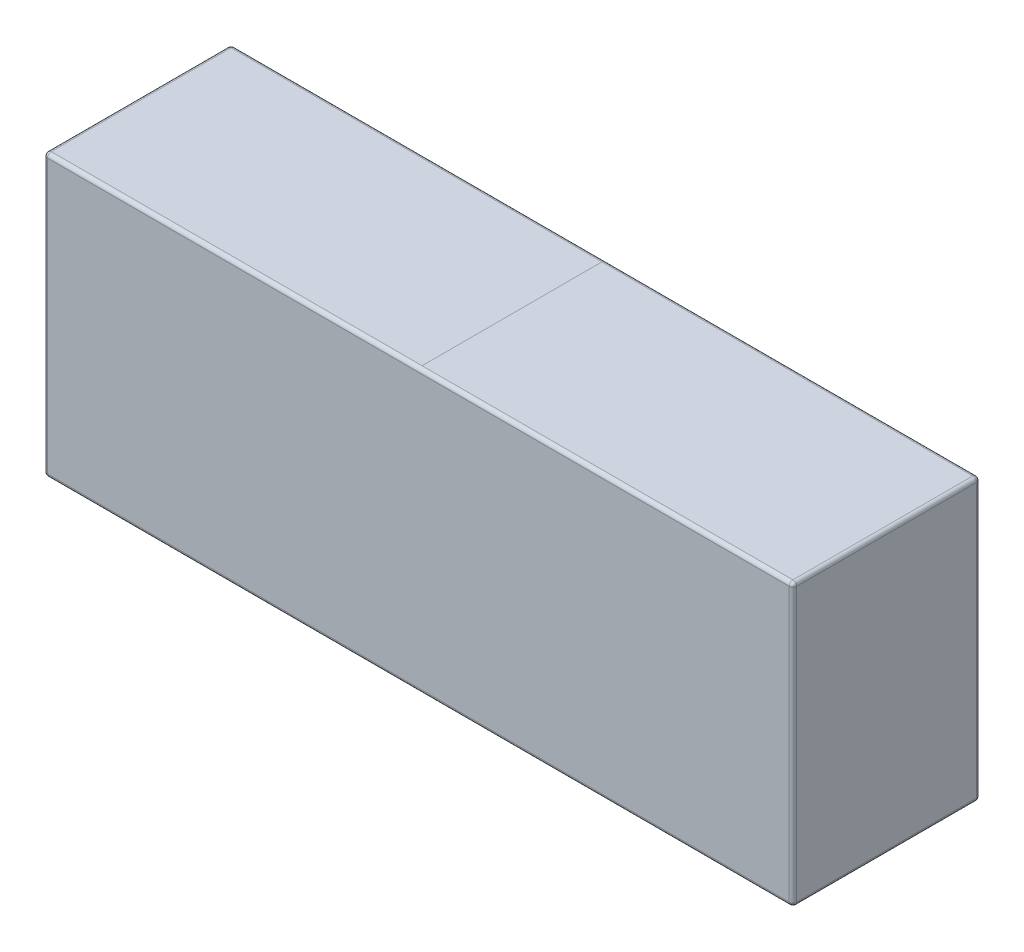
ISO-10303-21;
HEADER;
FILE_DESCRIPTION(('STEP AP214'),'2;1');
FILE_NAME('part.step','',(''),(''),'','','');
FILE_SCHEMA(('AUTOMOTIVE_DESIGN { 1 0 10303 214 1 1 1 1 }'));
ENDSEC;
DATA;
#1=APPLICATION_CONTEXT('core data for automotive mechanical design processes');
#2=APPLICATION_PROTOCOL_DEFINITION('international standard','automotive_design',2000,#1);
#3=PRODUCT_CONTEXT('',#1,'mechanical');
#4=PRODUCT('Part','Part','',(#3));
#5=PRODUCT_RELATED_PRODUCT_CATEGORY('part','',(#4));
#6=PRODUCT_DEFINITION_FORMATION('','',#4);
#7=PRODUCT_DEFINITION_CONTEXT('part definition',#1,'design');
#8=PRODUCT_DEFINITION('design','',#6,#7);
#9=PRODUCT_DEFINITION_SHAPE('','',#8);
#10=(LENGTH_UNIT() NAMED_UNIT(*) SI_UNIT(.MILLI.,.METRE.));
#11=(NAMED_UNIT(*) PLANE_ANGLE_UNIT() SI_UNIT($,.RADIAN.));
#12=(NAMED_UNIT(*) SI_UNIT($,.STERADIAN.) SOLID_ANGLE_UNIT());
#13=UNCERTAINTY_MEASURE_WITH_UNIT(LENGTH_MEASURE(1.E-05),#10,'distance_accuracy_value','');
#14=(GEOMETRIC_REPRESENTATION_CONTEXT(3) GLOBAL_UNCERTAINTY_ASSIGNED_CONTEXT((#13)) GLOBAL_UNIT_ASSIGNED_CONTEXT((#10,
#11,#12)) REPRESENTATION_CONTEXT('',''));
#15=CARTESIAN_POINT('',(0.,0.,0.));
#16=DIRECTION('',(0.,0.,1.));
#17=DIRECTION('',(1.,0.,0.));
#18=AXIS2_PLACEMENT_3D('',#15,#16,#17);
#19=CARTESIAN_POINT('',(-20.,7.5,10.));
#20=DIRECTION('',(0.,-1.,0.));
#21=DIRECTION('',(0.,0.,-1.));
#22=AXIS2_PLACEMENT_3D('',#19,#20,#21);
#23=PLANE('',#22);
#24=DIRECTION('',(0.,0.,1.));
#25=VECTOR('',#24,1.);
#26=CARTESIAN_POINT('',(0.,7.5,10.));
#27=LINE('',#26,#25);
#28=CARTESIAN_POINT('',(0.,7.5,0.200000000000001));
#29=VERTEX_POINT('',#28);
#30=CARTESIAN_POINT('',(0.,7.5,9.8));
#31=VERTEX_POINT('',#30);
#32=EDGE_CURVE('E11',#29,#31,#27,.T.);
#33=ORIENTED_EDGE('',*,*,#32,.F.);
#34=DIRECTION('',(-1.,0.,0.));
#35=VECTOR('',#34,1.);
#36=CARTESIAN_POINT('',(-20.,7.5,0.200000000000001));
#37=LINE('',#36,#35);
#38=CARTESIAN_POINT('',(-19.8,7.5,0.200000000000001));
#39=VERTEX_POINT('',#38);
#40=EDGE_CURVE('E218',#29,#39,#37,.T.);
#41=ORIENTED_EDGE('',*,*,#40,.T.);
#42=DIRECTION('',(0.,0.,-1.));
#43=VECTOR('',#42,1.);
#44=CARTESIAN_POINT('',(-19.8,7.5,10.));
#45=LINE('',#44,#43);
#46=CARTESIAN_POINT('',(-19.8,7.5,9.8));
#47=VERTEX_POINT('',#46);
#48=EDGE_CURVE('E221',#39,#47,#45,.F.);
#49=ORIENTED_EDGE('',*,*,#48,.T.);
#50=DIRECTION('',(-1.,0.,0.));
#51=VECTOR('',#50,1.);
#52=CARTESIAN_POINT('',(20.,7.5,9.8));
#53=LINE('',#52,#51);
#54=EDGE_CURVE('E224',#47,#31,#53,.F.);
#55=ORIENTED_EDGE('',*,*,#54,.T.);
#56=EDGE_LOOP('',(#33,#41,#49,#55));
#57=FACE_BOUND('',#56,.T.);
#58=ADVANCED_FACE('F46',(#57),#23,.F.);
#59=CARTESIAN_POINT('',(20.,7.5,10.));
#60=DIRECTION('',(-1.,0.,0.));
#61=DIRECTION('',(0.,0.,1.));
#62=AXIS2_PLACEMENT_3D('',#59,#60,#61);
#63=PLANE('',#62);
#64=DIRECTION('',(0.,1.,0.));
#65=VECTOR('',#64,1.);
#66=CARTESIAN_POINT('',(20.,-7.5,9.8));
#67=LINE('',#66,#65);
#68=CARTESIAN_POINT('',(20.,7.3,9.8));
#69=VERTEX_POINT('',#68);
#70=CARTESIAN_POINT('',(20.,-7.3,9.8));
#71=VERTEX_POINT('',#70);
#72=EDGE_CURVE('E204',#69,#71,#67,.F.);
#73=ORIENTED_EDGE('',*,*,#72,.T.);
#74=DIRECTION('',(0.,0.,-1.));
#75=VECTOR('',#74,1.);
#76=CARTESIAN_POINT('',(20.,-7.3,10.));
#77=LINE('',#76,#75);
#78=CARTESIAN_POINT('',(20.,-7.3,0.200000000000001));
#79=VERTEX_POINT('',#78);
#80=EDGE_CURVE('E157',#71,#79,#77,.T.);
#81=ORIENTED_EDGE('',*,*,#80,.T.);
#82=DIRECTION('',(0.,1.,0.));
#83=VECTOR('',#82,1.);
#84=CARTESIAN_POINT('',(20.,7.5,0.200000000000001));
#85=LINE('',#84,#83);
#86=CARTESIAN_POINT('',(20.,7.3,0.200000000000001));
#87=VERTEX_POINT('',#86);
#88=EDGE_CURVE('E206',#79,#87,#85,.T.);
#89=ORIENTED_EDGE('',*,*,#88,.T.);
#90=DIRECTION('',(0.,0.,-1.));
#91=VECTOR('',#90,1.);
#92=CARTESIAN_POINT('',(20.,7.3,10.));
#93=LINE('',#92,#91);
#94=EDGE_CURVE('E202',#87,#69,#93,.F.);
#95=ORIENTED_EDGE('',*,*,#94,.T.);
#96=EDGE_LOOP('',(#73,#81,#89,#95));
#97=FACE_BOUND('',#96,.T.);
#98=ADVANCED_FACE('F318',(#97),#63,.F.);
#99=CARTESIAN_POINT('',(19.8,7.5,0.200000000000001));
#100=VERTEX_POINT('',#99);
#101=EDGE_CURVE('E219',#100,#29,#37,.T.);
#102=ORIENTED_EDGE('',*,*,#101,.T.);
#103=ORIENTED_EDGE('',*,*,#32,.T.);
#104=CARTESIAN_POINT('',(19.8,7.5,9.8));
#105=VERTEX_POINT('',#104);
#106=EDGE_CURVE('E223',#31,#105,#53,.F.);
#107=ORIENTED_EDGE('',*,*,#106,.T.);
#108=DIRECTION('',(0.,0.,-1.));
#109=VECTOR('',#108,1.);
#110=CARTESIAN_POINT('',(19.8,7.5,10.));
#111=LINE('',#110,#109);
#112=EDGE_CURVE('E55',#105,#100,#111,.T.);
#113=ORIENTED_EDGE('',*,*,#112,.T.);
#114=EDGE_LOOP('',(#102,#103,#107,#113));
#115=FACE_BOUND('',#114,.T.);
#116=ADVANCED_FACE('F299',(#115),#23,.F.);
#117=CARTESIAN_POINT('',(-20.,7.5,10.));
#118=DIRECTION('',(1.,0.,0.));
#119=DIRECTION('',(0.,1.,0.));
#120=AXIS2_PLACEMENT_3D('',#117,#118,#119);
#121=PLANE('',#120);
#122=DIRECTION('',(0.,-1.,0.));
#123=VECTOR('',#122,1.);
#124=CARTESIAN_POINT('',(-20.,7.5,0.200000000000001));
#125=LINE('',#124,#123);
#126=CARTESIAN_POINT('',(-20.,7.3,0.200000000000001));
#127=VERTEX_POINT('',#126);
#128=CARTESIAN_POINT('',(-20.,-7.3,0.200000000000001));
#129=VERTEX_POINT('',#128);
#130=EDGE_CURVE('E188',#127,#129,#125,.T.);
#131=ORIENTED_EDGE('',*,*,#130,.T.);
#132=DIRECTION('',(0.,0.,-1.));
#133=VECTOR('',#132,1.);
#134=CARTESIAN_POINT('',(-20.,-7.3,10.));
#135=LINE('',#134,#133);
#136=CARTESIAN_POINT('',(-20.,-7.3,9.8));
#137=VERTEX_POINT('',#136);
#138=EDGE_CURVE('E190',#129,#137,#135,.F.);
#139=ORIENTED_EDGE('',*,*,#138,.T.);
#140=DIRECTION('',(0.,-1.,0.));
#141=VECTOR('',#140,1.);
#142=CARTESIAN_POINT('',(-20.,7.5,9.8));
#143=LINE('',#142,#141);
#144=CARTESIAN_POINT('',(-20.,7.3,9.8));
#145=VERTEX_POINT('',#144);
#146=EDGE_CURVE('E186',#137,#145,#143,.F.);
#147=ORIENTED_EDGE('',*,*,#146,.T.);
#148=DIRECTION('',(0.,0.,-1.));
#149=VECTOR('',#148,1.);
#150=CARTESIAN_POINT('',(-20.,7.3,10.));
#151=LINE('',#150,#149);
#152=EDGE_CURVE('E184',#145,#127,#151,.T.);
#153=ORIENTED_EDGE('',*,*,#152,.T.);
#154=EDGE_LOOP('',(#131,#139,#147,#153));
#155=FACE_BOUND('',#154,.T.);
#156=ADVANCED_FACE('F325',(#155),#121,.F.);
#157=CARTESIAN_POINT('',(-20.,-7.5,10.));
#158=DIRECTION('',(0.,1.,0.));
#159=DIRECTION('',(0.,0.,1.));
#160=AXIS2_PLACEMENT_3D('',#157,#158,#159);
#161=PLANE('',#160);
#162=DIRECTION('',(1.,0.,0.));
#163=VECTOR('',#162,1.);
#164=CARTESIAN_POINT('',(-20.,-7.5,9.8));
#165=LINE('',#164,#163);
#166=CARTESIAN_POINT('',(19.8,-7.5,9.8));
#167=VERTEX_POINT('',#166);
#168=CARTESIAN_POINT('',(-19.8,-7.5,9.8));
#169=VERTEX_POINT('',#168);
#170=EDGE_CURVE('E143',#167,#169,#165,.F.);
#171=ORIENTED_EDGE('',*,*,#170,.T.);
#172=DIRECTION('',(0.,0.,-1.));
#173=VECTOR('',#172,1.);
#174=CARTESIAN_POINT('',(-19.8,-7.5,10.));
#175=LINE('',#174,#173);
#176=CARTESIAN_POINT('',(-19.8,-7.5,0.200000000000001));
#177=VERTEX_POINT('',#176);
#178=EDGE_CURVE('E182',#169,#177,#175,.T.);
#179=ORIENTED_EDGE('',*,*,#178,.T.);
#180=DIRECTION('',(1.,0.,0.));
#181=VECTOR('',#180,1.);
#182=CARTESIAN_POINT('',(-20.,-7.5,0.200000000000001));
#183=LINE('',#182,#181);
#184=CARTESIAN_POINT('',(19.8,-7.5,0.200000000000001));
#185=VERTEX_POINT('',#184);
#186=EDGE_CURVE('E146',#177,#185,#183,.T.);
#187=ORIENTED_EDGE('',*,*,#186,.T.);
#188=DIRECTION('',(0.,0.,-1.));
#189=VECTOR('',#188,1.);
#190=CARTESIAN_POINT('',(19.8,-7.5,10.));
#191=LINE('',#190,#189);
#192=EDGE_CURVE('E138',#185,#167,#191,.F.);
#193=ORIENTED_EDGE('',*,*,#192,.T.);
#194=EDGE_LOOP('',(#171,#179,#187,#193));
#195=FACE_BOUND('',#194,.T.);
#196=ADVANCED_FACE('F140',(#195),#161,.F.);
#197=CARTESIAN_POINT('',(0.,0.,10.));
#198=DIRECTION('',(0.,0.,1.));
#199=DIRECTION('',(1.,0.,0.));
#200=AXIS2_PLACEMENT_3D('',#197,#198,#199);
#201=PLANE('',#200);
#202=DIRECTION('',(0.,-1.,0.));
#203=VECTOR('',#202,1.);
#204=CARTESIAN_POINT('',(-19.8,-7.5,10.));
#205=LINE('',#204,#203);
#206=CARTESIAN_POINT('',(-19.8,7.3,10.));
#207=VERTEX_POINT('',#206);
#208=CARTESIAN_POINT('',(-19.8,-7.3,10.));
#209=VERTEX_POINT('',#208);
#210=EDGE_CURVE('E213',#207,#209,#205,.T.);
#211=ORIENTED_EDGE('',*,*,#210,.T.);
#212=DIRECTION('',(1.,0.,0.));
#213=VECTOR('',#212,1.);
#214=CARTESIAN_POINT('',(20.,-7.3,10.));
#215=LINE('',#214,#213);
#216=CARTESIAN_POINT('',(19.8,-7.3,10.));
#217=VERTEX_POINT('',#216);
#218=EDGE_CURVE('E215',#209,#217,#215,.T.);
#219=ORIENTED_EDGE('',*,*,#218,.T.);
#220=DIRECTION('',(0.,1.,0.));
#221=VECTOR('',#220,1.);
#222=CARTESIAN_POINT('',(19.8,7.5,10.));
#223=LINE('',#222,#221);
#224=CARTESIAN_POINT('',(19.8,7.3,10.));
#225=VERTEX_POINT('',#224);
#226=EDGE_CURVE('E211',#217,#225,#223,.T.);
#227=ORIENTED_EDGE('',*,*,#226,.T.);
#228=DIRECTION('',(-1.,0.,0.));
#229=VECTOR('',#228,1.);
#230=CARTESIAN_POINT('',(-20.,7.3,10.));
#231=LINE('',#230,#229);
#232=EDGE_CURVE('E209',#225,#207,#231,.T.);
#233=ORIENTED_EDGE('',*,*,#232,.T.);
#234=EDGE_LOOP('',(#211,#219,#227,#233));
#235=FACE_BOUND('',#234,.T.);
#236=ADVANCED_FACE('F313',(#235),#201,.T.);
#237=CARTESIAN_POINT('',(0.,0.,0.));
#238=DIRECTION('',(0.,0.,1.));
#239=DIRECTION('',(1.,0.,0.));
#240=AXIS2_PLACEMENT_3D('',#237,#238,#239);
#241=PLANE('',#240);
#242=DIRECTION('',(1.,0.,0.));
#243=VECTOR('',#242,1.);
#244=CARTESIAN_POINT('',(0.,-7.3,0.));
#245=LINE('',#244,#243);
#246=CARTESIAN_POINT('',(19.8,-7.3,0.));
#247=VERTEX_POINT('',#246);
#248=CARTESIAN_POINT('',(-19.8,-7.3,0.));
#249=VERTEX_POINT('',#248);
#250=EDGE_CURVE('E197',#247,#249,#245,.F.);
#251=ORIENTED_EDGE('',*,*,#250,.T.);
#252=DIRECTION('',(0.,-1.,0.));
#253=VECTOR('',#252,1.);
#254=CARTESIAN_POINT('',(-19.8,0.,0.));
#255=LINE('',#254,#253);
#256=CARTESIAN_POINT('',(-19.8,7.3,0.));
#257=VERTEX_POINT('',#256);
#258=EDGE_CURVE('E199',#249,#257,#255,.F.);
#259=ORIENTED_EDGE('',*,*,#258,.T.);
#260=DIRECTION('',(-1.,0.,0.));
#261=VECTOR('',#260,1.);
#262=CARTESIAN_POINT('',(0.,7.3,0.));
#263=LINE('',#262,#261);
#264=CARTESIAN_POINT('',(19.8,7.3,0.));
#265=VERTEX_POINT('',#264);
#266=EDGE_CURVE('E193',#257,#265,#263,.F.);
#267=ORIENTED_EDGE('',*,*,#266,.T.);
#268=DIRECTION('',(0.,1.,0.));
#269=VECTOR('',#268,1.);
#270=CARTESIAN_POINT('',(19.8,0.,0.));
#271=LINE('',#270,#269);
#272=EDGE_CURVE('E195',#265,#247,#271,.F.);
#273=ORIENTED_EDGE('',*,*,#272,.T.);
#274=EDGE_LOOP('',(#251,#259,#267,#273));
#275=FACE_BOUND('',#274,.T.);
#276=ADVANCED_FACE('F292',(#275),#241,.F.);
#277=CARTESIAN_POINT('',(19.8,7.3,10.));
#278=DIRECTION('',(0.,0.,-1.));
#279=DIRECTION('',(-1.,0.,0.));
#280=AXIS2_PLACEMENT_3D('',#277,#278,#279);
#281=CYLINDRICAL_SURFACE('',#280,0.2);
#282=CARTESIAN_POINT('',(19.8,7.3,9.8));
#283=DIRECTION('',(0.,0.,1.));
#284=DIRECTION('',(1.,0.,0.));
#285=AXIS2_PLACEMENT_3D('',#282,#283,#284);
#286=CIRCLE('',#285,0.2);
#287=EDGE_CURVE('E176',#69,#105,#286,.T.);
#288=ORIENTED_EDGE('',*,*,#287,.F.);
#289=ORIENTED_EDGE('',*,*,#94,.F.);
#290=CARTESIAN_POINT('',(19.8,7.3,0.200000000000001));
#291=DIRECTION('',(0.,0.,-1.));
#292=DIRECTION('',(-1.,0.,0.));
#293=AXIS2_PLACEMENT_3D('',#290,#291,#292);
#294=CIRCLE('',#293,0.2);
#295=EDGE_CURVE('E179',#100,#87,#294,.T.);
#296=ORIENTED_EDGE('',*,*,#295,.F.);
#297=ORIENTED_EDGE('',*,*,#112,.F.);
#298=EDGE_LOOP('',(#288,#289,#296,#297));
#299=FACE_BOUND('',#298,.T.);
#300=ADVANCED_FACE('F48',(#299),#281,.T.);
#301=CARTESIAN_POINT('',(19.8,7.3,9.8));
#302=DIRECTION('',(0.,1.,0.));
#303=DIRECTION('',(0.,0.,1.));
#304=AXIS2_PLACEMENT_3D('',#301,#302,#303);
#305=SPHERICAL_SURFACE('',#304,0.2);
#306=CARTESIAN_POINT('',(19.8,7.3,9.8));
#307=DIRECTION('',(0.,1.,0.));
#308=DIRECTION('',(0.,0.,1.));
#309=AXIS2_PLACEMENT_3D('',#306,#307,#308);
#310=CIRCLE('',#309,0.2);
#311=EDGE_CURVE('E270',#69,#225,#310,.F.);
#312=ORIENTED_EDGE('',*,*,#311,.F.);
#313=ORIENTED_EDGE('',*,*,#287,.T.);
#314=CARTESIAN_POINT('',(19.8,7.3,9.8));
#315=DIRECTION('',(1.,0.,0.));
#316=DIRECTION('',(0.,0.,-1.));
#317=AXIS2_PLACEMENT_3D('',#314,#315,#316);
#318=CIRCLE('',#317,0.2);
#319=EDGE_CURVE('E273',#225,#105,#318,.F.);
#320=ORIENTED_EDGE('',*,*,#319,.F.);
#321=EDGE_LOOP('',(#312,#313,#320));
#322=FACE_BOUND('',#321,.T.);
#323=ADVANCED_FACE('F304',(#322),#305,.T.);
#324=CARTESIAN_POINT('',(19.8,7.3,0.2));
#325=DIRECTION('',(1.,0.,0.));
#326=DIRECTION('',(0.,0.,-1.));
#327=AXIS2_PLACEMENT_3D('',#324,#325,#326);
#328=SPHERICAL_SURFACE('',#327,0.2);
#329=CARTESIAN_POINT('',(19.8,7.3,0.2));
#330=DIRECTION('',(1.,0.,0.));
#331=DIRECTION('',(0.,0.,-1.));
#332=AXIS2_PLACEMENT_3D('',#329,#330,#331);
#333=CIRCLE('',#332,0.2);
#334=EDGE_CURVE('E264',#100,#265,#333,.F.);
#335=ORIENTED_EDGE('',*,*,#334,.F.);
#336=ORIENTED_EDGE('',*,*,#295,.T.);
#337=CARTESIAN_POINT('',(19.8,7.3,0.200000000000001));
#338=DIRECTION('',(0.,1.,0.));
#339=DIRECTION('',(0.,0.,1.));
#340=AXIS2_PLACEMENT_3D('',#337,#338,#339);
#341=CIRCLE('',#340,0.2);
#342=EDGE_CURVE('E267',#265,#87,#341,.F.);
#343=ORIENTED_EDGE('',*,*,#342,.F.);
#344=EDGE_LOOP('',(#335,#336,#343));
#345=FACE_BOUND('',#344,.T.);
#346=ADVANCED_FACE('F281',(#345),#328,.T.);
#347=CARTESIAN_POINT('',(0.,7.3,9.8));
#348=DIRECTION('',(1.,0.,0.));
#349=DIRECTION('',(0.,0.,-1.));
#350=AXIS2_PLACEMENT_3D('',#347,#348,#349);
#351=CYLINDRICAL_SURFACE('',#350,0.2);
#352=ORIENTED_EDGE('',*,*,#319,.T.);
#353=ORIENTED_EDGE('',*,*,#106,.F.);
#354=ORIENTED_EDGE('',*,*,#54,.F.);
#355=CARTESIAN_POINT('',(-19.8,7.3,9.8));
#356=DIRECTION('',(-1.,0.,0.));
#357=DIRECTION('',(0.,0.,1.));
#358=AXIS2_PLACEMENT_3D('',#355,#356,#357);
#359=CIRCLE('',#358,0.2);
#360=EDGE_CURVE('E258',#207,#47,#359,.T.);
#361=ORIENTED_EDGE('',*,*,#360,.F.);
#362=ORIENTED_EDGE('',*,*,#232,.F.);
#363=EDGE_LOOP('',(#352,#353,#354,#361,#362));
#364=FACE_BOUND('',#363,.T.);
#365=ADVANCED_FACE('F308',(#364),#351,.T.);
#366=CARTESIAN_POINT('',(19.8,0.,9.8));
#367=DIRECTION('',(0.,-1.,0.));
#368=DIRECTION('',(0.,0.,-1.));
#369=AXIS2_PLACEMENT_3D('',#366,#367,#368);
#370=CYLINDRICAL_SURFACE('',#369,0.2);
#371=ORIENTED_EDGE('',*,*,#311,.T.);
#372=ORIENTED_EDGE('',*,*,#226,.F.);
#373=CARTESIAN_POINT('',(19.8,-7.3,9.8));
#374=DIRECTION('',(0.,-1.,0.));
#375=DIRECTION('',(0.,0.,-1.));
#376=AXIS2_PLACEMENT_3D('',#373,#374,#375);
#377=CIRCLE('',#376,0.2);
#378=EDGE_CURVE('E161',#71,#217,#377,.T.);
#379=ORIENTED_EDGE('',*,*,#378,.F.);
#380=ORIENTED_EDGE('',*,*,#72,.F.);
#381=EDGE_LOOP('',(#371,#372,#379,#380));
#382=FACE_BOUND('',#381,.T.);
#383=ADVANCED_FACE('F316',(#382),#370,.T.);
#384=CARTESIAN_POINT('',(19.8,-7.3,10.));
#385=DIRECTION('',(0.,0.,-1.));
#386=DIRECTION('',(-1.,0.,0.));
#387=AXIS2_PLACEMENT_3D('',#384,#385,#386);
#388=CYLINDRICAL_SURFACE('',#387,0.2);
#389=CARTESIAN_POINT('',(19.8,-7.3,0.200000000000001));
#390=DIRECTION('',(0.,0.,-1.));
#391=DIRECTION('',(-1.,0.,0.));
#392=AXIS2_PLACEMENT_3D('',#389,#390,#391);
#393=CIRCLE('',#392,0.2);
#394=EDGE_CURVE('E162',#79,#185,#393,.T.);
#395=ORIENTED_EDGE('',*,*,#394,.F.);
#396=ORIENTED_EDGE('',*,*,#80,.F.);
#397=CARTESIAN_POINT('',(19.8,-7.3,9.8));
#398=DIRECTION('',(0.,0.,1.));
#399=DIRECTION('',(1.,0.,0.));
#400=AXIS2_PLACEMENT_3D('',#397,#398,#399);
#401=CIRCLE('',#400,0.2);
#402=EDGE_CURVE('E153',#167,#71,#401,.T.);
#403=ORIENTED_EDGE('',*,*,#402,.F.);
#404=ORIENTED_EDGE('',*,*,#192,.F.);
#405=EDGE_LOOP('',(#395,#396,#403,#404));
#406=FACE_BOUND('',#405,.T.);
#407=ADVANCED_FACE('F155',(#406),#388,.T.);
#408=CARTESIAN_POINT('',(19.8,7.5,0.200000000000001));
#409=DIRECTION('',(0.,1.,0.));
#410=DIRECTION('',(0.,0.,1.));
#411=AXIS2_PLACEMENT_3D('',#408,#409,#410);
#412=CYLINDRICAL_SURFACE('',#411,0.2);
#413=ORIENTED_EDGE('',*,*,#342,.T.);
#414=ORIENTED_EDGE('',*,*,#88,.F.);
#415=CARTESIAN_POINT('',(19.8,-7.3,0.2));
#416=DIRECTION('',(0.,-1.,0.));
#417=DIRECTION('',(1.,0.,0.));
#418=AXIS2_PLACEMENT_3D('',#415,#416,#417);
#419=CIRCLE('',#418,0.2);
#420=EDGE_CURVE('E254',#247,#79,#419,.T.);
#421=ORIENTED_EDGE('',*,*,#420,.F.);
#422=ORIENTED_EDGE('',*,*,#272,.F.);
#423=EDGE_LOOP('',(#413,#414,#421,#422));
#424=FACE_BOUND('',#423,.T.);
#425=ADVANCED_FACE('F288',(#424),#412,.T.);
#426=CARTESIAN_POINT('',(-20.,7.3,0.200000000000001));
#427=DIRECTION('',(-1.,0.,0.));
#428=DIRECTION('',(0.,0.,1.));
#429=AXIS2_PLACEMENT_3D('',#426,#427,#428);
#430=CYLINDRICAL_SURFACE('',#429,0.2);
#431=ORIENTED_EDGE('',*,*,#334,.T.);
#432=ORIENTED_EDGE('',*,*,#266,.F.);
#433=CARTESIAN_POINT('',(-19.8,7.3,0.200000000000001));
#434=DIRECTION('',(-1.,0.,0.));
#435=DIRECTION('',(0.,0.,1.));
#436=AXIS2_PLACEMENT_3D('',#433,#434,#435);
#437=CIRCLE('',#436,0.2);
#438=EDGE_CURVE('E251',#39,#257,#437,.T.);
#439=ORIENTED_EDGE('',*,*,#438,.F.);
#440=ORIENTED_EDGE('',*,*,#40,.F.);
#441=ORIENTED_EDGE('',*,*,#101,.F.);
#442=EDGE_LOOP('',(#431,#432,#439,#440,#441));
#443=FACE_BOUND('',#442,.T.);
#444=ADVANCED_FACE('F298',(#443),#430,.T.);
#445=CARTESIAN_POINT('',(-19.8,7.3,10.));
#446=DIRECTION('',(0.,0.,-1.));
#447=DIRECTION('',(-1.,0.,0.));
#448=AXIS2_PLACEMENT_3D('',#445,#446,#447);
#449=CYLINDRICAL_SURFACE('',#448,0.2);
#450=CARTESIAN_POINT('',(-19.8,7.3,9.8));
#451=DIRECTION('',(0.,0.,1.));
#452=DIRECTION('',(1.,0.,0.));
#453=AXIS2_PLACEMENT_3D('',#450,#451,#452);
#454=CIRCLE('',#453,0.2);
#455=EDGE_CURVE('E261',#47,#145,#454,.T.);
#456=ORIENTED_EDGE('',*,*,#455,.F.);
#457=ORIENTED_EDGE('',*,*,#48,.F.);
#458=CARTESIAN_POINT('',(-19.8,7.3,0.200000000000001));
#459=DIRECTION('',(0.,0.,-1.));
#460=DIRECTION('',(-1.,0.,0.));
#461=AXIS2_PLACEMENT_3D('',#458,#459,#460);
#462=CIRCLE('',#461,0.2);
#463=EDGE_CURVE('E248',#127,#39,#462,.T.);
#464=ORIENTED_EDGE('',*,*,#463,.F.);
#465=ORIENTED_EDGE('',*,*,#152,.F.);
#466=EDGE_LOOP('',(#456,#457,#464,#465));
#467=FACE_BOUND('',#466,.T.);
#468=ADVANCED_FACE('F369',(#467),#449,.T.);
#469=CARTESIAN_POINT('',(-19.8,7.3,9.8));
#470=DIRECTION('',(0.,1.,0.));
#471=DIRECTION('',(0.,0.,1.));
#472=AXIS2_PLACEMENT_3D('',#469,#470,#471);
#473=SPHERICAL_SURFACE('',#472,0.2);
#474=ORIENTED_EDGE('',*,*,#360,.T.);
#475=ORIENTED_EDGE('',*,*,#455,.T.);
#476=CARTESIAN_POINT('',(-19.8,7.3,9.8));
#477=DIRECTION('',(0.,1.,0.));
#478=DIRECTION('',(0.,0.,1.));
#479=AXIS2_PLACEMENT_3D('',#476,#477,#478);
#480=CIRCLE('',#479,0.2);
#481=EDGE_CURVE('E169',#207,#145,#480,.F.);
#482=ORIENTED_EDGE('',*,*,#481,.F.);
#483=EDGE_LOOP('',(#474,#475,#482));
#484=FACE_BOUND('',#483,.T.);
#485=ADVANCED_FACE('F366',(#484),#473,.T.);
#486=CARTESIAN_POINT('',(19.8,-7.3,9.8));
#487=DIRECTION('',(1.,0.,0.));
#488=DIRECTION('',(0.,1.,0.));
#489=AXIS2_PLACEMENT_3D('',#486,#487,#488);
#490=SPHERICAL_SURFACE('',#489,0.2);
#491=ORIENTED_EDGE('',*,*,#402,.T.);
#492=ORIENTED_EDGE('',*,*,#378,.T.);
#493=CARTESIAN_POINT('',(19.8,-7.3,9.8));
#494=DIRECTION('',(1.,0.,0.));
#495=DIRECTION('',(0.,0.,-1.));
#496=AXIS2_PLACEMENT_3D('',#493,#494,#495);
#497=CIRCLE('',#496,0.2);
#498=EDGE_CURVE('E164',#167,#217,#497,.F.);
#499=ORIENTED_EDGE('',*,*,#498,.F.);
#500=EDGE_LOOP('',(#491,#492,#499));
#501=FACE_BOUND('',#500,.T.);
#502=ADVANCED_FACE('F165',(#501),#490,.T.);
#503=CARTESIAN_POINT('',(19.8,-7.3,0.2));
#504=DIRECTION('',(1.,0.,0.));
#505=DIRECTION('',(0.,1.,0.));
#506=AXIS2_PLACEMENT_3D('',#503,#504,#505);
#507=SPHERICAL_SURFACE('',#506,0.2);
#508=ORIENTED_EDGE('',*,*,#420,.T.);
#509=ORIENTED_EDGE('',*,*,#394,.T.);
#510=CARTESIAN_POINT('',(19.8,-7.3,0.200000000000001));
#511=DIRECTION('',(1.,0.,0.));
#512=DIRECTION('',(0.,0.,-1.));
#513=AXIS2_PLACEMENT_3D('',#510,#511,#512);
#514=CIRCLE('',#513,0.2);
#515=EDGE_CURVE('E170',#247,#185,#514,.F.);
#516=ORIENTED_EDGE('',*,*,#515,.F.);
#517=EDGE_LOOP('',(#508,#509,#516));
#518=FACE_BOUND('',#517,.T.);
#519=ADVANCED_FACE('F359',(#518),#507,.T.);
#520=CARTESIAN_POINT('',(-19.8,7.3,0.2));
#521=DIRECTION('',(0.,1.,0.));
#522=DIRECTION('',(0.,0.,1.));
#523=AXIS2_PLACEMENT_3D('',#520,#521,#522);
#524=SPHERICAL_SURFACE('',#523,0.2);
#525=ORIENTED_EDGE('',*,*,#463,.T.);
#526=ORIENTED_EDGE('',*,*,#438,.T.);
#527=CARTESIAN_POINT('',(-19.8,7.3,0.2));
#528=DIRECTION('',(0.,1.,0.));
#529=DIRECTION('',(0.,0.,1.));
#530=AXIS2_PLACEMENT_3D('',#527,#528,#529);
#531=CIRCLE('',#530,0.2);
#532=EDGE_CURVE('E242',#127,#257,#531,.F.);
#533=ORIENTED_EDGE('',*,*,#532,.F.);
#534=EDGE_LOOP('',(#525,#526,#533));
#535=FACE_BOUND('',#534,.T.);
#536=ADVANCED_FACE('F355',(#535),#524,.T.);
#537=CARTESIAN_POINT('',(-19.8,0.,9.8));
#538=DIRECTION('',(0.,1.,0.));
#539=DIRECTION('',(-1.,0.,0.));
#540=AXIS2_PLACEMENT_3D('',#537,#538,#539);
#541=CYLINDRICAL_SURFACE('',#540,0.2);
#542=ORIENTED_EDGE('',*,*,#481,.T.);
#543=ORIENTED_EDGE('',*,*,#146,.F.);
#544=CARTESIAN_POINT('',(-19.8,-7.3,9.8));
#545=DIRECTION('',(0.,-1.,0.));
#546=DIRECTION('',(0.,0.,-1.));
#547=AXIS2_PLACEMENT_3D('',#544,#545,#546);
#548=CIRCLE('',#547,0.2);
#549=EDGE_CURVE('E239',#209,#137,#548,.T.);
#550=ORIENTED_EDGE('',*,*,#549,.F.);
#551=ORIENTED_EDGE('',*,*,#210,.F.);
#552=EDGE_LOOP('',(#542,#543,#550,#551));
#553=FACE_BOUND('',#552,.T.);
#554=ADVANCED_FACE('F352',(#553),#541,.T.);
#555=CARTESIAN_POINT('',(0.,-7.3,9.8));
#556=DIRECTION('',(-1.,0.,0.));
#557=DIRECTION('',(0.,0.,1.));
#558=AXIS2_PLACEMENT_3D('',#555,#556,#557);
#559=CYLINDRICAL_SURFACE('',#558,0.2);
#560=ORIENTED_EDGE('',*,*,#498,.T.);
#561=ORIENTED_EDGE('',*,*,#218,.F.);
#562=CARTESIAN_POINT('',(-19.8,-7.3,9.8));
#563=DIRECTION('',(-1.,0.,0.));
#564=DIRECTION('',(0.,0.,1.));
#565=AXIS2_PLACEMENT_3D('',#562,#563,#564);
#566=CIRCLE('',#565,0.2);
#567=EDGE_CURVE('E174',#169,#209,#566,.T.);
#568=ORIENTED_EDGE('',*,*,#567,.F.);
#569=ORIENTED_EDGE('',*,*,#170,.F.);
#570=EDGE_LOOP('',(#560,#561,#568,#569));
#571=FACE_BOUND('',#570,.T.);
#572=ADVANCED_FACE('F172',(#571),#559,.T.);
#573=CARTESIAN_POINT('',(-20.,-7.3,0.200000000000001));
#574=DIRECTION('',(1.,0.,0.));
#575=DIRECTION('',(0.,0.,-1.));
#576=AXIS2_PLACEMENT_3D('',#573,#574,#575);
#577=CYLINDRICAL_SURFACE('',#576,0.2);
#578=ORIENTED_EDGE('',*,*,#515,.T.);
#579=ORIENTED_EDGE('',*,*,#186,.F.);
#580=CARTESIAN_POINT('',(-19.8,-7.3,0.2));
#581=DIRECTION('',(-1.,0.,0.));
#582=DIRECTION('',(0.,0.,1.));
#583=AXIS2_PLACEMENT_3D('',#580,#581,#582);
#584=CIRCLE('',#583,0.2);
#585=EDGE_CURVE('E235',#249,#177,#584,.T.);
#586=ORIENTED_EDGE('',*,*,#585,.F.);
#587=ORIENTED_EDGE('',*,*,#250,.F.);
#588=EDGE_LOOP('',(#578,#579,#586,#587));
#589=FACE_BOUND('',#588,.T.);
#590=ADVANCED_FACE('F345',(#589),#577,.T.);
#591=CARTESIAN_POINT('',(-19.8,7.5,0.200000000000001));
#592=DIRECTION('',(0.,-1.,0.));
#593=DIRECTION('',(1.,0.,0.));
#594=AXIS2_PLACEMENT_3D('',#591,#592,#593);
#595=CYLINDRICAL_SURFACE('',#594,0.2);
#596=ORIENTED_EDGE('',*,*,#532,.T.);
#597=ORIENTED_EDGE('',*,*,#258,.F.);
#598=CARTESIAN_POINT('',(-19.8,-7.3,0.200000000000001));
#599=DIRECTION('',(0.,-1.,0.));
#600=DIRECTION('',(0.,0.,-1.));
#601=AXIS2_PLACEMENT_3D('',#598,#599,#600);
#602=CIRCLE('',#601,0.2);
#603=EDGE_CURVE('E232',#129,#249,#602,.T.);
#604=ORIENTED_EDGE('',*,*,#603,.F.);
#605=ORIENTED_EDGE('',*,*,#130,.F.);
#606=EDGE_LOOP('',(#596,#597,#604,#605));
#607=FACE_BOUND('',#606,.T.);
#608=ADVANCED_FACE('F341',(#607),#595,.T.);
#609=CARTESIAN_POINT('',(-19.8,-7.3,9.8));
#610=DIRECTION('',(0.,0.,1.));
#611=DIRECTION('',(1.,0.,0.));
#612=AXIS2_PLACEMENT_3D('',#609,#610,#611);
#613=SPHERICAL_SURFACE('',#612,0.2);
#614=ORIENTED_EDGE('',*,*,#567,.T.);
#615=ORIENTED_EDGE('',*,*,#549,.T.);
#616=CARTESIAN_POINT('',(-19.8,-7.3,9.8));
#617=DIRECTION('',(0.,0.,1.));
#618=DIRECTION('',(1.,0.,0.));
#619=AXIS2_PLACEMENT_3D('',#616,#617,#618);
#620=CIRCLE('',#619,0.2);
#621=EDGE_CURVE('E230',#169,#137,#620,.F.);
#622=ORIENTED_EDGE('',*,*,#621,.F.);
#623=EDGE_LOOP('',(#614,#615,#622));
#624=FACE_BOUND('',#623,.T.);
#625=ADVANCED_FACE('F337',(#624),#613,.T.);
#626=CARTESIAN_POINT('',(-19.8,-7.3,0.2));
#627=DIRECTION('',(0.,0.,-1.));
#628=DIRECTION('',(-1.,0.,0.));
#629=AXIS2_PLACEMENT_3D('',#626,#627,#628);
#630=SPHERICAL_SURFACE('',#629,0.2);
#631=ORIENTED_EDGE('',*,*,#603,.T.);
#632=ORIENTED_EDGE('',*,*,#585,.T.);
#633=CARTESIAN_POINT('',(-19.8,-7.3,0.200000000000001));
#634=DIRECTION('',(0.,0.,-1.));
#635=DIRECTION('',(-1.,0.,0.));
#636=AXIS2_PLACEMENT_3D('',#633,#634,#635);
#637=CIRCLE('',#636,0.2);
#638=EDGE_CURVE('E228',#129,#177,#637,.F.);
#639=ORIENTED_EDGE('',*,*,#638,.F.);
#640=EDGE_LOOP('',(#631,#632,#639));
#641=FACE_BOUND('',#640,.T.);
#642=ADVANCED_FACE('F333',(#641),#630,.T.);
#643=CARTESIAN_POINT('',(-19.8,-7.3,10.));
#644=DIRECTION('',(0.,0.,-1.));
#645=DIRECTION('',(-1.,0.,0.));
#646=AXIS2_PLACEMENT_3D('',#643,#644,#645);
#647=CYLINDRICAL_SURFACE('',#646,0.2);
#648=ORIENTED_EDGE('',*,*,#621,.T.);
#649=ORIENTED_EDGE('',*,*,#138,.F.);
#650=ORIENTED_EDGE('',*,*,#638,.T.);
#651=ORIENTED_EDGE('',*,*,#178,.F.);
#652=EDGE_LOOP('',(#648,#649,#650,#651));
#653=FACE_BOUND('',#652,.T.);
#654=ADVANCED_FACE('F330',(#653),#647,.T.);
#655=CLOSED_SHELL('',(#58,#98,#116,#156,#196,#236,#276,#300,#323,#346,#365,#383,#407,#425,#444,
#468,#485,#502,#519,#536,#554,#572,#590,#608,#625,#642,#654));
#656=MANIFOLD_SOLID_BREP('B2',#655);
#657=ADVANCED_BREP_SHAPE_REPRESENTATION('',(#18,#656),#14);
#658=SHAPE_DEFINITION_REPRESENTATION(#9,#657);
ENDSEC;
END-ISO-10303-21;
